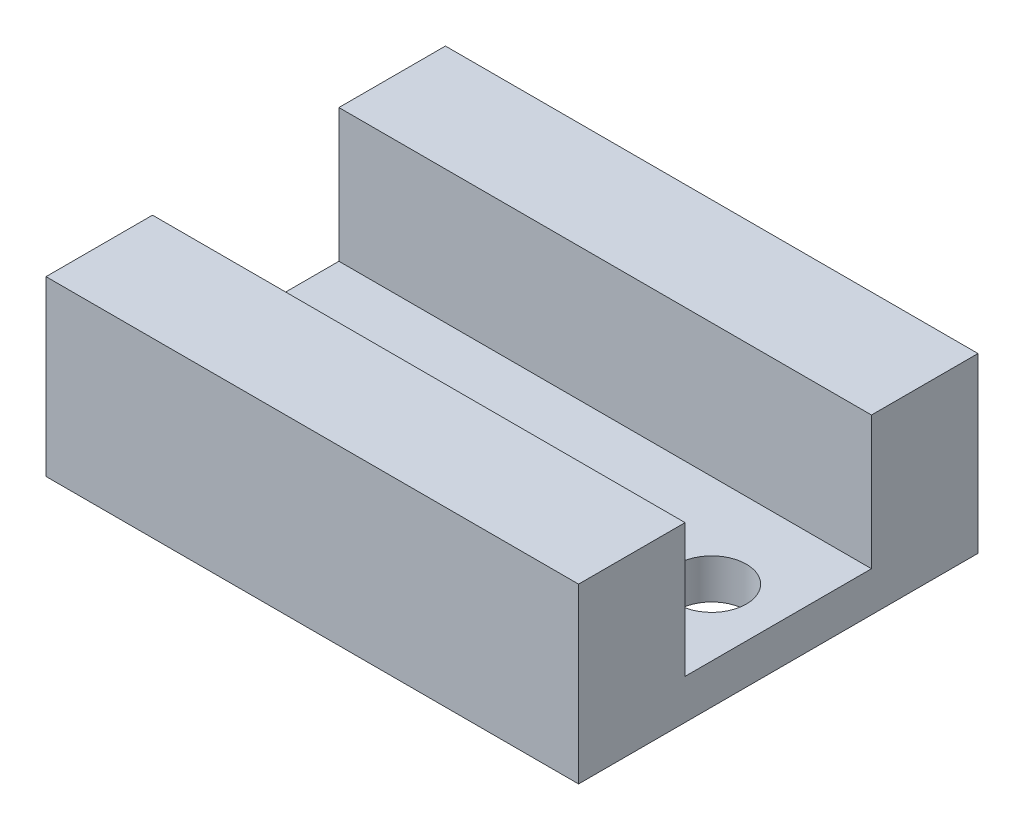
ISO-10303-21;
HEADER;
FILE_DESCRIPTION(('STEP AP214'),'2;1');
FILE_NAME('part.step','',(''),(''),'','','');
FILE_SCHEMA(('AUTOMOTIVE_DESIGN { 1 0 10303 214 1 1 1 1 }'));
ENDSEC;
DATA;
#1=APPLICATION_CONTEXT('core data for automotive mechanical design processes');
#2=APPLICATION_PROTOCOL_DEFINITION('international standard','automotive_design',2000,#1);
#3=PRODUCT_CONTEXT('',#1,'mechanical');
#4=PRODUCT('Part','Part','',(#3));
#5=PRODUCT_RELATED_PRODUCT_CATEGORY('part','',(#4));
#6=PRODUCT_DEFINITION_FORMATION('','',#4);
#7=PRODUCT_DEFINITION_CONTEXT('part definition',#1,'design');
#8=PRODUCT_DEFINITION('design','',#6,#7);
#9=PRODUCT_DEFINITION_SHAPE('','',#8);
#10=(LENGTH_UNIT() NAMED_UNIT(*) SI_UNIT(.MILLI.,.METRE.));
#11=(NAMED_UNIT(*) PLANE_ANGLE_UNIT() SI_UNIT($,.RADIAN.));
#12=(NAMED_UNIT(*) SI_UNIT($,.STERADIAN.) SOLID_ANGLE_UNIT());
#13=UNCERTAINTY_MEASURE_WITH_UNIT(LENGTH_MEASURE(1.E-05),#10,'distance_accuracy_value','');
#14=(GEOMETRIC_REPRESENTATION_CONTEXT(3) GLOBAL_UNCERTAINTY_ASSIGNED_CONTEXT((#13)) GLOBAL_UNIT_ASSIGNED_CONTEXT((#10,
#11,#12)) REPRESENTATION_CONTEXT('',''));
#15=CARTESIAN_POINT('',(0.,0.,0.));
#16=DIRECTION('',(0.,0.,1.));
#17=DIRECTION('',(1.,0.,0.));
#18=AXIS2_PLACEMENT_3D('',#15,#16,#17);
#19=CARTESIAN_POINT('',(0.,1.5,0.));
#20=DIRECTION('',(0.,1.,0.));
#21=DIRECTION('',(0.,0.,1.));
#22=AXIS2_PLACEMENT_3D('',#19,#20,#21);
#23=PLANE('',#22);
#24=CARTESIAN_POINT('',(7.5,1.5,0.));
#25=DIRECTION('',(0.,1.,0.));
#26=DIRECTION('',(0.,0.,1.));
#27=AXIS2_PLACEMENT_3D('',#24,#25,#26);
#28=CIRCLE('',#27,1.3);
#29=CARTESIAN_POINT('',(7.5,1.5,1.3));
#30=VERTEX_POINT('',#29);
#31=EDGE_CURVE('E189',#30,#30,#28,.T.);
#32=ORIENTED_EDGE('',*,*,#31,.F.);
#33=EDGE_LOOP('',(#32));
#34=FACE_BOUND('',#33,.T.);
#35=CARTESIAN_POINT('',(-7.5,1.5,0.));
#36=DIRECTION('',(0.,1.,0.));
#37=DIRECTION('',(0.,0.,1.));
#38=AXIS2_PLACEMENT_3D('',#35,#36,#37);
#39=CIRCLE('',#38,1.3);
#40=CARTESIAN_POINT('',(-7.5,1.5,1.3));
#41=VERTEX_POINT('',#40);
#42=EDGE_CURVE('E179',#41,#41,#39,.T.);
#43=ORIENTED_EDGE('',*,*,#42,.F.);
#44=EDGE_LOOP('',(#43));
#45=FACE_BOUND('',#44,.T.);
#46=DIRECTION('',(0.,0.,1.));
#47=VECTOR('',#46,1.);
#48=CARTESIAN_POINT('',(-10.,1.5,-7.5));
#49=LINE('',#48,#47);
#50=CARTESIAN_POINT('',(-10.,1.5,-3.5));
#51=VERTEX_POINT('',#50);
#52=CARTESIAN_POINT('',(-10.,1.5,3.5));
#53=VERTEX_POINT('',#52);
#54=EDGE_CURVE('E68',#51,#53,#49,.T.);
#55=ORIENTED_EDGE('',*,*,#54,.T.);
#56=DIRECTION('',(-1.,0.,0.));
#57=VECTOR('',#56,1.);
#58=CARTESIAN_POINT('',(-10.,1.5,3.5));
#59=LINE('',#58,#57);
#60=CARTESIAN_POINT('',(10.,1.5,3.5));
#61=VERTEX_POINT('',#60);
#62=EDGE_CURVE('E63',#61,#53,#59,.T.);
#63=ORIENTED_EDGE('',*,*,#62,.F.);
#64=DIRECTION('',(0.,0.,-1.));
#65=VECTOR('',#64,1.);
#66=CARTESIAN_POINT('',(10.,1.5,-7.5));
#67=LINE('',#66,#65);
#68=CARTESIAN_POINT('',(10.,1.5,-3.5));
#69=VERTEX_POINT('',#68);
#70=EDGE_CURVE('E198',#61,#69,#67,.T.);
#71=ORIENTED_EDGE('',*,*,#70,.T.);
#72=DIRECTION('',(1.,0.,0.));
#73=VECTOR('',#72,1.);
#74=CARTESIAN_POINT('',(-10.,1.5,-3.5));
#75=LINE('',#74,#73);
#76=EDGE_CURVE('E155',#51,#69,#75,.T.);
#77=ORIENTED_EDGE('',*,*,#76,.F.);
#78=EDGE_LOOP('',(#55,#63,#71,#77));
#79=FACE_BOUND('',#78,.T.);
#80=ADVANCED_FACE('F44',(#34,#45,#79),#23,.T.);
#81=CARTESIAN_POINT('',(0.,0.,0.));
#82=DIRECTION('',(0.,1.,0.));
#83=DIRECTION('',(0.,0.,1.));
#84=AXIS2_PLACEMENT_3D('',#81,#82,#83);
#85=PLANE('',#84);
#86=DIRECTION('',(0.,0.,-1.));
#87=VECTOR('',#86,1.);
#88=CARTESIAN_POINT('',(10.,0.,-7.5));
#89=LINE('',#88,#87);
#90=CARTESIAN_POINT('',(10.,0.,7.5));
#91=VERTEX_POINT('',#90);
#92=CARTESIAN_POINT('',(10.,0.,-7.5));
#93=VERTEX_POINT('',#92);
#94=EDGE_CURVE('E195',#91,#93,#89,.T.);
#95=ORIENTED_EDGE('',*,*,#94,.F.);
#96=DIRECTION('',(1.,0.,0.));
#97=VECTOR('',#96,1.);
#98=CARTESIAN_POINT('',(-10.,0.,7.5));
#99=LINE('',#98,#97);
#100=CARTESIAN_POINT('',(-10.,0.,7.5));
#101=VERTEX_POINT('',#100);
#102=EDGE_CURVE('E197',#101,#91,#99,.T.);
#103=ORIENTED_EDGE('',*,*,#102,.F.);
#104=DIRECTION('',(0.,0.,1.));
#105=VECTOR('',#104,1.);
#106=CARTESIAN_POINT('',(-10.,0.,-7.5));
#107=LINE('',#106,#105);
#108=CARTESIAN_POINT('',(-10.,0.,-7.5));
#109=VERTEX_POINT('',#108);
#110=EDGE_CURVE('E120',#109,#101,#107,.T.);
#111=ORIENTED_EDGE('',*,*,#110,.F.);
#112=DIRECTION('',(-1.,0.,0.));
#113=VECTOR('',#112,1.);
#114=CARTESIAN_POINT('',(-10.,0.,-7.5));
#115=LINE('',#114,#113);
#116=EDGE_CURVE('E201',#93,#109,#115,.T.);
#117=ORIENTED_EDGE('',*,*,#116,.F.);
#118=EDGE_LOOP('',(#95,#103,#111,#117));
#119=FACE_BOUND('',#118,.T.);
#120=CARTESIAN_POINT('',(7.5,0.,0.));
#121=DIRECTION('',(0.,1.,0.));
#122=DIRECTION('',(0.,0.,1.));
#123=AXIS2_PLACEMENT_3D('',#120,#121,#122);
#124=CIRCLE('',#123,1.3);
#125=CARTESIAN_POINT('',(7.5,0.,1.3));
#126=VERTEX_POINT('',#125);
#127=EDGE_CURVE('E183',#126,#126,#124,.T.);
#128=ORIENTED_EDGE('',*,*,#127,.T.);
#129=EDGE_LOOP('',(#128));
#130=FACE_BOUND('',#129,.T.);
#131=CARTESIAN_POINT('',(-7.5,0.,0.));
#132=DIRECTION('',(0.,1.,0.));
#133=DIRECTION('',(0.,0.,1.));
#134=AXIS2_PLACEMENT_3D('',#131,#132,#133);
#135=CIRCLE('',#134,1.3);
#136=CARTESIAN_POINT('',(-7.5,0.,1.3));
#137=VERTEX_POINT('',#136);
#138=EDGE_CURVE('E177',#137,#137,#135,.T.);
#139=ORIENTED_EDGE('',*,*,#138,.T.);
#140=EDGE_LOOP('',(#139));
#141=FACE_BOUND('',#140,.T.);
#142=ADVANCED_FACE('F219',(#119,#130,#141),#85,.F.);
#143=CARTESIAN_POINT('',(10.,1.5,-7.5));
#144=DIRECTION('',(-1.,0.,0.));
#145=DIRECTION('',(0.,0.,1.));
#146=AXIS2_PLACEMENT_3D('',#143,#144,#145);
#147=PLANE('',#146);
#148=ORIENTED_EDGE('',*,*,#94,.T.);
#149=DIRECTION('',(0.,-1.,0.));
#150=VECTOR('',#149,1.);
#151=CARTESIAN_POINT('',(10.,1.5,-7.5));
#152=LINE('',#151,#150);
#153=CARTESIAN_POINT('',(10.,6.5,-7.5));
#154=VERTEX_POINT('',#153);
#155=EDGE_CURVE('E11',#154,#93,#152,.T.);
#156=ORIENTED_EDGE('',*,*,#155,.F.);
#157=DIRECTION('',(0.,0.,-1.));
#158=VECTOR('',#157,1.);
#159=CARTESIAN_POINT('',(10.,6.5,-7.5));
#160=LINE('',#159,#158);
#161=CARTESIAN_POINT('',(10.,6.5,-3.5));
#162=VERTEX_POINT('',#161);
#163=EDGE_CURVE('E156',#162,#154,#160,.T.);
#164=ORIENTED_EDGE('',*,*,#163,.F.);
#165=DIRECTION('',(0.,-1.,0.));
#166=VECTOR('',#165,1.);
#167=CARTESIAN_POINT('',(10.,6.5,-3.5));
#168=LINE('',#167,#166);
#169=EDGE_CURVE('E166',#162,#69,#168,.T.);
#170=ORIENTED_EDGE('',*,*,#169,.T.);
#171=ORIENTED_EDGE('',*,*,#70,.F.);
#172=DIRECTION('',(0.,-1.,0.));
#173=VECTOR('',#172,1.);
#174=CARTESIAN_POINT('',(10.,6.5,3.5));
#175=LINE('',#174,#173);
#176=CARTESIAN_POINT('',(10.,6.5,3.5));
#177=VERTEX_POINT('',#176);
#178=EDGE_CURVE('E146',#177,#61,#175,.T.);
#179=ORIENTED_EDGE('',*,*,#178,.F.);
#180=DIRECTION('',(0.,0.,-1.));
#181=VECTOR('',#180,1.);
#182=CARTESIAN_POINT('',(10.,6.5,7.5));
#183=LINE('',#182,#181);
#184=CARTESIAN_POINT('',(10.,6.5,7.5));
#185=VERTEX_POINT('',#184);
#186=EDGE_CURVE('E129',#185,#177,#183,.T.);
#187=ORIENTED_EDGE('',*,*,#186,.F.);
#188=DIRECTION('',(0.,-1.,0.));
#189=VECTOR('',#188,1.);
#190=CARTESIAN_POINT('',(10.,1.5,7.5));
#191=LINE('',#190,#189);
#192=EDGE_CURVE('E122',#185,#91,#191,.T.);
#193=ORIENTED_EDGE('',*,*,#192,.T.);
#194=EDGE_LOOP('',(#148,#156,#164,#170,#171,#179,#187,#193));
#195=FACE_BOUND('',#194,.T.);
#196=ADVANCED_FACE('F50',(#195),#147,.F.);
#197=CARTESIAN_POINT('',(-10.,1.5,-7.5));
#198=DIRECTION('',(0.,0.,1.));
#199=DIRECTION('',(1.,0.,0.));
#200=AXIS2_PLACEMENT_3D('',#197,#198,#199);
#201=PLANE('',#200);
#202=ORIENTED_EDGE('',*,*,#116,.T.);
#203=DIRECTION('',(0.,-1.,0.));
#204=VECTOR('',#203,1.);
#205=CARTESIAN_POINT('',(-10.,1.5,-7.5));
#206=LINE('',#205,#204);
#207=CARTESIAN_POINT('',(-10.,6.5,-7.5));
#208=VERTEX_POINT('',#207);
#209=EDGE_CURVE('E53',#208,#109,#206,.T.);
#210=ORIENTED_EDGE('',*,*,#209,.F.);
#211=DIRECTION('',(-1.,0.,0.));
#212=VECTOR('',#211,1.);
#213=CARTESIAN_POINT('',(-10.,6.5,-7.5));
#214=LINE('',#213,#212);
#215=EDGE_CURVE('E165',#154,#208,#214,.T.);
#216=ORIENTED_EDGE('',*,*,#215,.F.);
#217=ORIENTED_EDGE('',*,*,#155,.T.);
#218=EDGE_LOOP('',(#202,#210,#216,#217));
#219=FACE_BOUND('',#218,.T.);
#220=ADVANCED_FACE('F235',(#219),#201,.F.);
#221=CARTESIAN_POINT('',(-10.,1.5,-7.5));
#222=DIRECTION('',(1.,0.,0.));
#223=DIRECTION('',(0.,0.,-1.));
#224=AXIS2_PLACEMENT_3D('',#221,#222,#223);
#225=PLANE('',#224);
#226=ORIENTED_EDGE('',*,*,#110,.T.);
#227=DIRECTION('',(0.,-1.,0.));
#228=VECTOR('',#227,1.);
#229=CARTESIAN_POINT('',(-10.,1.5,7.5));
#230=LINE('',#229,#228);
#231=CARTESIAN_POINT('',(-10.,6.5,7.5));
#232=VERTEX_POINT('',#231);
#233=EDGE_CURVE('E107',#232,#101,#230,.T.);
#234=ORIENTED_EDGE('',*,*,#233,.F.);
#235=DIRECTION('',(0.,0.,1.));
#236=VECTOR('',#235,1.);
#237=CARTESIAN_POINT('',(-10.,6.5,7.5));
#238=LINE('',#237,#236);
#239=CARTESIAN_POINT('',(-10.,6.5,3.5));
#240=VERTEX_POINT('',#239);
#241=EDGE_CURVE('E112',#240,#232,#238,.T.);
#242=ORIENTED_EDGE('',*,*,#241,.F.);
#243=DIRECTION('',(0.,-1.,0.));
#244=VECTOR('',#243,1.);
#245=CARTESIAN_POINT('',(-10.,6.5,3.5));
#246=LINE('',#245,#244);
#247=EDGE_CURVE('E144',#240,#53,#246,.T.);
#248=ORIENTED_EDGE('',*,*,#247,.T.);
#249=ORIENTED_EDGE('',*,*,#54,.F.);
#250=DIRECTION('',(0.,-1.,0.));
#251=VECTOR('',#250,1.);
#252=CARTESIAN_POINT('',(-10.,6.5,-3.5));
#253=LINE('',#252,#251);
#254=CARTESIAN_POINT('',(-10.,6.5,-3.5));
#255=VERTEX_POINT('',#254);
#256=EDGE_CURVE('E174',#255,#51,#253,.T.);
#257=ORIENTED_EDGE('',*,*,#256,.F.);
#258=DIRECTION('',(0.,0.,1.));
#259=VECTOR('',#258,1.);
#260=CARTESIAN_POINT('',(-10.,6.5,-7.5));
#261=LINE('',#260,#259);
#262=EDGE_CURVE('E151',#208,#255,#261,.T.);
#263=ORIENTED_EDGE('',*,*,#262,.F.);
#264=ORIENTED_EDGE('',*,*,#209,.T.);
#265=EDGE_LOOP('',(#226,#234,#242,#248,#249,#257,#263,#264));
#266=FACE_BOUND('',#265,.T.);
#267=ADVANCED_FACE('F111',(#266),#225,.F.);
#268=CARTESIAN_POINT('',(-10.,1.5,7.5));
#269=DIRECTION('',(0.,0.,-1.));
#270=DIRECTION('',(-1.,0.,0.));
#271=AXIS2_PLACEMENT_3D('',#268,#269,#270);
#272=PLANE('',#271);
#273=ORIENTED_EDGE('',*,*,#102,.T.);
#274=ORIENTED_EDGE('',*,*,#192,.F.);
#275=DIRECTION('',(1.,0.,0.));
#276=VECTOR('',#275,1.);
#277=CARTESIAN_POINT('',(-10.,6.5,7.5));
#278=LINE('',#277,#276);
#279=EDGE_CURVE('E121',#232,#185,#278,.T.);
#280=ORIENTED_EDGE('',*,*,#279,.F.);
#281=ORIENTED_EDGE('',*,*,#233,.T.);
#282=EDGE_LOOP('',(#273,#274,#280,#281));
#283=FACE_BOUND('',#282,.T.);
#284=ADVANCED_FACE('F123',(#283),#272,.F.);
#285=CARTESIAN_POINT('',(7.5,1.5,0.));
#286=DIRECTION('',(0.,-1.,0.));
#287=DIRECTION('',(0.,0.,-1.));
#288=AXIS2_PLACEMENT_3D('',#285,#286,#287);
#289=CYLINDRICAL_SURFACE('',#288,1.3);
#290=ORIENTED_EDGE('',*,*,#31,.T.);
#291=EDGE_LOOP('',(#290));
#292=FACE_BOUND('',#291,.T.);
#293=ORIENTED_EDGE('',*,*,#127,.F.);
#294=EDGE_LOOP('',(#293));
#295=FACE_BOUND('',#294,.T.);
#296=ADVANCED_FACE('F249',(#292,#295),#289,.F.);
#297=CARTESIAN_POINT('',(-7.5,1.5,0.));
#298=DIRECTION('',(0.,-1.,0.));
#299=DIRECTION('',(0.,0.,-1.));
#300=AXIS2_PLACEMENT_3D('',#297,#298,#299);
#301=CYLINDRICAL_SURFACE('',#300,1.3);
#302=ORIENTED_EDGE('',*,*,#42,.T.);
#303=EDGE_LOOP('',(#302));
#304=FACE_BOUND('',#303,.T.);
#305=ORIENTED_EDGE('',*,*,#138,.F.);
#306=EDGE_LOOP('',(#305));
#307=FACE_BOUND('',#306,.T.);
#308=ADVANCED_FACE('F256',(#304,#307),#301,.F.);
#309=CARTESIAN_POINT('',(-10.,6.5,-3.5));
#310=DIRECTION('',(0.,0.,-1.));
#311=DIRECTION('',(-1.,0.,0.));
#312=AXIS2_PLACEMENT_3D('',#309,#310,#311);
#313=PLANE('',#312);
#314=ORIENTED_EDGE('',*,*,#76,.T.);
#315=ORIENTED_EDGE('',*,*,#169,.F.);
#316=DIRECTION('',(1.,0.,0.));
#317=VECTOR('',#316,1.);
#318=CARTESIAN_POINT('',(-10.,6.5,-3.5));
#319=LINE('',#318,#317);
#320=EDGE_CURVE('E159',#255,#162,#319,.T.);
#321=ORIENTED_EDGE('',*,*,#320,.F.);
#322=ORIENTED_EDGE('',*,*,#256,.T.);
#323=EDGE_LOOP('',(#314,#315,#321,#322));
#324=FACE_BOUND('',#323,.T.);
#325=ADVANCED_FACE('F227',(#324),#313,.F.);
#326=CARTESIAN_POINT('',(0.,6.5,0.));
#327=DIRECTION('',(0.,1.,0.));
#328=DIRECTION('',(0.,0.,1.));
#329=AXIS2_PLACEMENT_3D('',#326,#327,#328);
#330=PLANE('',#329);
#331=ORIENTED_EDGE('',*,*,#262,.T.);
#332=ORIENTED_EDGE('',*,*,#320,.T.);
#333=ORIENTED_EDGE('',*,*,#163,.T.);
#334=ORIENTED_EDGE('',*,*,#215,.T.);
#335=EDGE_LOOP('',(#331,#332,#333,#334));
#336=FACE_BOUND('',#335,.T.);
#337=ADVANCED_FACE('F233',(#336),#330,.T.);
#338=CARTESIAN_POINT('',(-10.,6.5,3.5));
#339=DIRECTION('',(0.,0.,1.));
#340=DIRECTION('',(1.,0.,0.));
#341=AXIS2_PLACEMENT_3D('',#338,#339,#340);
#342=PLANE('',#341);
#343=ORIENTED_EDGE('',*,*,#62,.T.);
#344=ORIENTED_EDGE('',*,*,#247,.F.);
#345=DIRECTION('',(-1.,0.,0.));
#346=VECTOR('',#345,1.);
#347=CARTESIAN_POINT('',(-10.,6.5,3.5));
#348=LINE('',#347,#346);
#349=EDGE_CURVE('E132',#177,#240,#348,.T.);
#350=ORIENTED_EDGE('',*,*,#349,.F.);
#351=ORIENTED_EDGE('',*,*,#178,.T.);
#352=EDGE_LOOP('',(#343,#344,#350,#351));
#353=FACE_BOUND('',#352,.T.);
#354=ADVANCED_FACE('F221',(#353),#342,.F.);
#355=CARTESIAN_POINT('',(0.,6.5,0.));
#356=DIRECTION('',(0.,-1.,0.));
#357=DIRECTION('',(0.,0.,-1.));
#358=AXIS2_PLACEMENT_3D('',#355,#356,#357);
#359=PLANE('',#358);
#360=ORIENTED_EDGE('',*,*,#241,.T.);
#361=ORIENTED_EDGE('',*,*,#279,.T.);
#362=ORIENTED_EDGE('',*,*,#186,.T.);
#363=ORIENTED_EDGE('',*,*,#349,.T.);
#364=EDGE_LOOP('',(#360,#361,#362,#363));
#365=FACE_BOUND('',#364,.T.);
#366=ADVANCED_FACE('F135',(#365),#359,.F.);
#367=CLOSED_SHELL('',(#80,#142,#196,#220,#267,#284,#296,#308,#325,#337,#354,#366));
#368=MANIFOLD_SOLID_BREP('B2',#367);
#369=ADVANCED_BREP_SHAPE_REPRESENTATION('',(#18,#368),#14);
#370=SHAPE_DEFINITION_REPRESENTATION(#9,#369);
ENDSEC;
END-ISO-10303-21;
